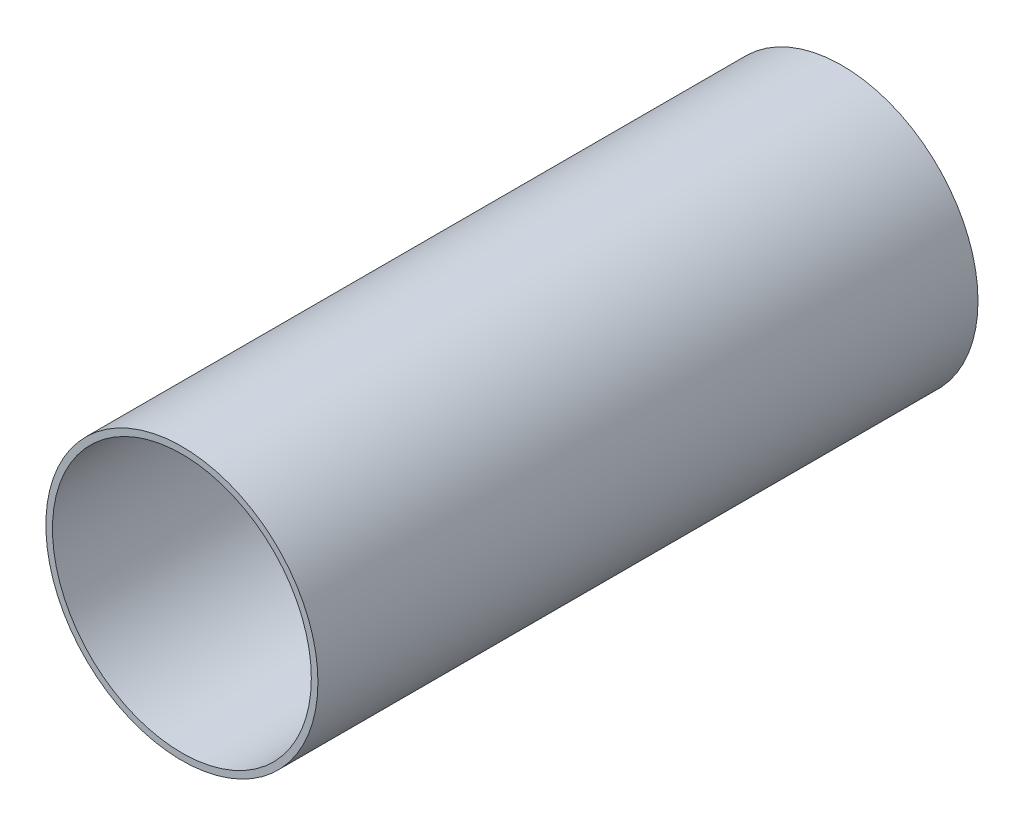
ISO-10303-21;
HEADER;
FILE_DESCRIPTION(('STEP AP214'),'2;1');
FILE_NAME('part.step','',(''),(''),'','','');
FILE_SCHEMA(('AUTOMOTIVE_DESIGN { 1 0 10303 214 1 1 1 1 }'));
ENDSEC;
DATA;
#1=APPLICATION_CONTEXT('core data for automotive mechanical design processes');
#2=APPLICATION_PROTOCOL_DEFINITION('international standard','automotive_design',2000,#1);
#3=PRODUCT_CONTEXT('',#1,'mechanical');
#4=PRODUCT('Part','Part','',(#3));
#5=PRODUCT_RELATED_PRODUCT_CATEGORY('part','',(#4));
#6=PRODUCT_DEFINITION_FORMATION('','',#4);
#7=PRODUCT_DEFINITION_CONTEXT('part definition',#1,'design');
#8=PRODUCT_DEFINITION('design','',#6,#7);
#9=PRODUCT_DEFINITION_SHAPE('','',#8);
#10=(LENGTH_UNIT() NAMED_UNIT(*) SI_UNIT(.MILLI.,.METRE.));
#11=(NAMED_UNIT(*) PLANE_ANGLE_UNIT() SI_UNIT($,.RADIAN.));
#12=(NAMED_UNIT(*) SI_UNIT($,.STERADIAN.) SOLID_ANGLE_UNIT());
#13=UNCERTAINTY_MEASURE_WITH_UNIT(LENGTH_MEASURE(1.E-05),#10,'distance_accuracy_value','');
#14=(GEOMETRIC_REPRESENTATION_CONTEXT(3) GLOBAL_UNCERTAINTY_ASSIGNED_CONTEXT((#13)) GLOBAL_UNIT_ASSIGNED_CONTEXT((#10,
#11,#12)) REPRESENTATION_CONTEXT('',''));
#15=CARTESIAN_POINT('',(0.,0.,0.));
#16=DIRECTION('',(0.,0.,1.));
#17=DIRECTION('',(1.,0.,0.));
#18=AXIS2_PLACEMENT_3D('',#15,#16,#17);
#19=CARTESIAN_POINT('',(0.,0.,82.));
#20=DIRECTION('',(0.,0.,-1.));
#21=DIRECTION('',(-1.,0.,0.));
#22=AXIS2_PLACEMENT_3D('',#19,#20,#21);
#23=CYLINDRICAL_SURFACE('',#22,16.9);
#24=CARTESIAN_POINT('',(0.,0.,82.));
#25=DIRECTION('',(0.,0.,1.));
#26=DIRECTION('',(1.,0.,0.));
#27=AXIS2_PLACEMENT_3D('',#24,#25,#26);
#28=CIRCLE('',#27,16.9);
#29=CARTESIAN_POINT('',(16.9,0.,82.));
#30=VERTEX_POINT('',#29);
#31=EDGE_CURVE('E10',#30,#30,#28,.T.);
#32=ORIENTED_EDGE('',*,*,#31,.F.);
#33=EDGE_LOOP('',(#32));
#34=FACE_BOUND('',#33,.T.);
#35=CARTESIAN_POINT('',(0.,0.,0.));
#36=DIRECTION('',(0.,0.,1.));
#37=DIRECTION('',(1.,0.,0.));
#38=AXIS2_PLACEMENT_3D('',#35,#36,#37);
#39=CIRCLE('',#38,16.9);
#40=CARTESIAN_POINT('',(16.9,0.,0.));
#41=VERTEX_POINT('',#40);
#42=EDGE_CURVE('E35',#41,#41,#39,.T.);
#43=ORIENTED_EDGE('',*,*,#42,.T.);
#44=EDGE_LOOP('',(#43));
#45=FACE_BOUND('',#44,.T.);
#46=ADVANCED_FACE('F32',(#34,#45),#23,.T.);
#47=CARTESIAN_POINT('',(0.,0.,82.));
#48=DIRECTION('',(0.,0.,1.));
#49=DIRECTION('',(1.,0.,0.));
#50=AXIS2_PLACEMENT_3D('',#47,#48,#49);
#51=PLANE('',#50);
#52=CARTESIAN_POINT('',(0.,0.,82.));
#53=DIRECTION('',(0.,0.,1.));
#54=DIRECTION('',(1.,0.,0.));
#55=AXIS2_PLACEMENT_3D('',#52,#53,#54);
#56=CIRCLE('',#55,16.08);
#57=CARTESIAN_POINT('',(16.08,0.,82.));
#58=VERTEX_POINT('',#57);
#59=EDGE_CURVE('E44',#58,#58,#56,.T.);
#60=ORIENTED_EDGE('',*,*,#59,.F.);
#61=EDGE_LOOP('',(#60));
#62=FACE_BOUND('',#61,.T.);
#63=ORIENTED_EDGE('',*,*,#31,.T.);
#64=EDGE_LOOP('',(#63));
#65=FACE_BOUND('',#64,.T.);
#66=ADVANCED_FACE('F59',(#62,#65),#51,.T.);
#67=CARTESIAN_POINT('',(0.,0.,0.));
#68=DIRECTION('',(0.,0.,1.));
#69=DIRECTION('',(1.,0.,0.));
#70=AXIS2_PLACEMENT_3D('',#67,#68,#69);
#71=PLANE('',#70);
#72=CARTESIAN_POINT('',(0.,0.,0.));
#73=DIRECTION('',(0.,0.,1.));
#74=DIRECTION('',(1.,0.,0.));
#75=AXIS2_PLACEMENT_3D('',#72,#73,#74);
#76=CIRCLE('',#75,16.08);
#77=CARTESIAN_POINT('',(16.08,0.,0.));
#78=VERTEX_POINT('',#77);
#79=EDGE_CURVE('E42',#78,#78,#76,.T.);
#80=ORIENTED_EDGE('',*,*,#79,.T.);
#81=EDGE_LOOP('',(#80));
#82=FACE_BOUND('',#81,.T.);
#83=ORIENTED_EDGE('',*,*,#42,.F.);
#84=EDGE_LOOP('',(#83));
#85=FACE_BOUND('',#84,.T.);
#86=ADVANCED_FACE('F50',(#82,#85),#71,.F.);
#87=CARTESIAN_POINT('',(0.,0.,0.));
#88=DIRECTION('',(0.,0.,1.));
#89=DIRECTION('',(1.,0.,0.));
#90=AXIS2_PLACEMENT_3D('',#87,#88,#89);
#91=CYLINDRICAL_SURFACE('',#90,16.08);
#92=ORIENTED_EDGE('',*,*,#79,.F.);
#93=EDGE_LOOP('',(#92));
#94=FACE_BOUND('',#93,.T.);
#95=ORIENTED_EDGE('',*,*,#59,.T.);
#96=EDGE_LOOP('',(#95));
#97=FACE_BOUND('',#96,.T.);
#98=ADVANCED_FACE('F53',(#94,#97),#91,.F.);
#99=CLOSED_SHELL('',(#46,#66,#86,#98));
#100=MANIFOLD_SOLID_BREP('B2',#99);
#101=ADVANCED_BREP_SHAPE_REPRESENTATION('',(#18,#100),#14);
#102=SHAPE_DEFINITION_REPRESENTATION(#9,#101);
ENDSEC;
END-ISO-10303-21;
